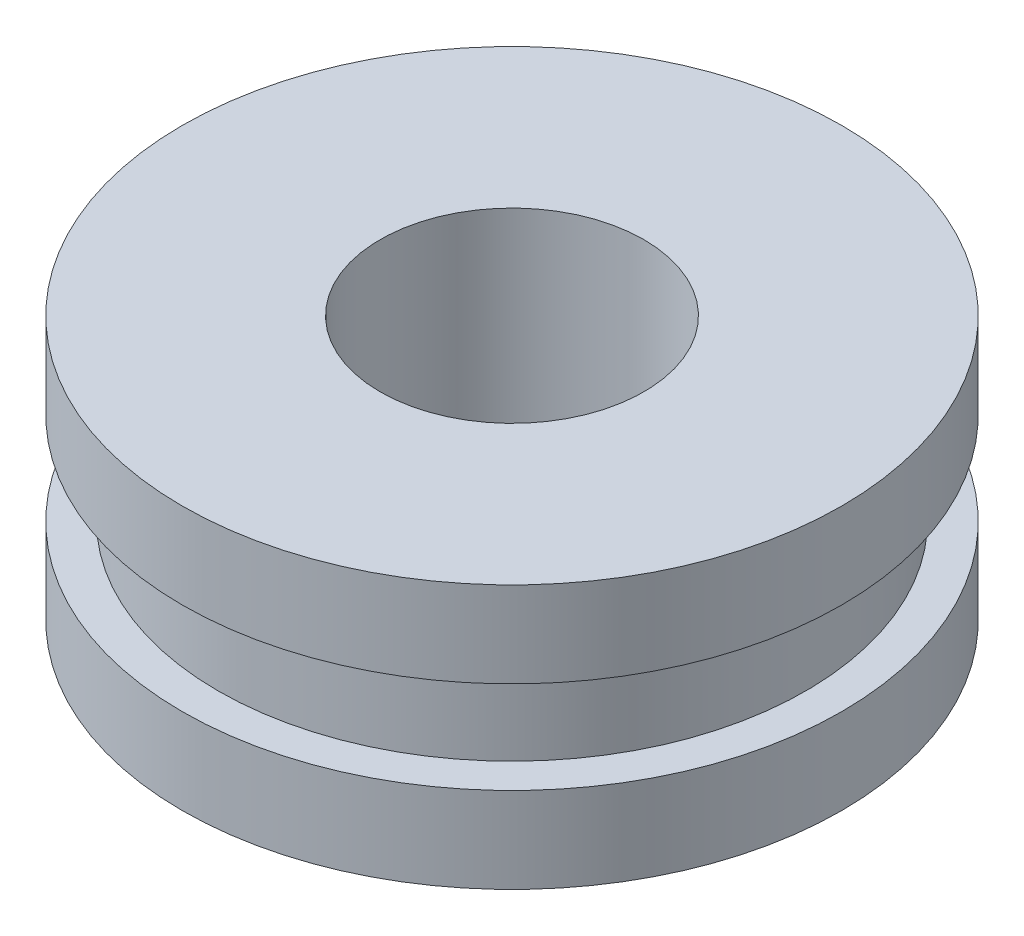
ISO-10303-21;
HEADER;
FILE_DESCRIPTION(('STEP AP214'),'2;1');
FILE_NAME('part.step','',(''),(''),'','','');
FILE_SCHEMA(('AUTOMOTIVE_DESIGN { 1 0 10303 214 1 1 1 1 }'));
ENDSEC;
DATA;
#1=APPLICATION_CONTEXT('core data for automotive mechanical design processes');
#2=APPLICATION_PROTOCOL_DEFINITION('international standard','automotive_design',2000,#1);
#3=PRODUCT_CONTEXT('',#1,'mechanical');
#4=PRODUCT('Part','Part','',(#3));
#5=PRODUCT_RELATED_PRODUCT_CATEGORY('part','',(#4));
#6=PRODUCT_DEFINITION_FORMATION('','',#4);
#7=PRODUCT_DEFINITION_CONTEXT('part definition',#1,'design');
#8=PRODUCT_DEFINITION('design','',#6,#7);
#9=PRODUCT_DEFINITION_SHAPE('','',#8);
#10=(LENGTH_UNIT() NAMED_UNIT(*) SI_UNIT(.MILLI.,.METRE.));
#11=(NAMED_UNIT(*) PLANE_ANGLE_UNIT() SI_UNIT($,.RADIAN.));
#12=(NAMED_UNIT(*) SI_UNIT($,.STERADIAN.) SOLID_ANGLE_UNIT());
#13=UNCERTAINTY_MEASURE_WITH_UNIT(LENGTH_MEASURE(1.E-05),#10,'distance_accuracy_value','');
#14=(GEOMETRIC_REPRESENTATION_CONTEXT(3) GLOBAL_UNCERTAINTY_ASSIGNED_CONTEXT((#13)) GLOBAL_UNIT_ASSIGNED_CONTEXT((#10,
#11,#12)) REPRESENTATION_CONTEXT('',''));
#15=CARTESIAN_POINT('',(0.,0.,0.));
#16=DIRECTION('',(0.,0.,1.));
#17=DIRECTION('',(1.,0.,0.));
#18=AXIS2_PLACEMENT_3D('',#15,#16,#17);
#19=CARTESIAN_POINT('',(0.,1.3,0.));
#20=DIRECTION('',(0.,1.,0.));
#21=DIRECTION('',(0.,0.,1.));
#22=AXIS2_PLACEMENT_3D('',#19,#20,#21);
#23=PLANE('',#22);
#24=CARTESIAN_POINT('',(0.,1.3,0.));
#25=DIRECTION('',(0.,1.,0.));
#26=DIRECTION('',(0.,0.,1.));
#27=AXIS2_PLACEMENT_3D('',#24,#25,#26);
#28=CIRCLE('',#27,4.45630958866855);
#29=CARTESIAN_POINT('',(0.,1.3,4.45630958866855));
#30=VERTEX_POINT('',#29);
#31=EDGE_CURVE('E10',#30,#30,#28,.T.);
#32=ORIENTED_EDGE('',*,*,#31,.F.);
#33=EDGE_LOOP('',(#32));
#34=FACE_BOUND('',#33,.T.);
#35=CARTESIAN_POINT('',(0.,1.3,0.));
#36=DIRECTION('',(0.,1.,0.));
#37=DIRECTION('',(0.,0.,1.));
#38=AXIS2_PLACEMENT_3D('',#35,#36,#37);
#39=CIRCLE('',#38,5.);
#40=CARTESIAN_POINT('',(0.,1.3,5.));
#41=VERTEX_POINT('',#40);
#42=EDGE_CURVE('E42',#41,#41,#39,.T.);
#43=ORIENTED_EDGE('',*,*,#42,.T.);
#44=EDGE_LOOP('',(#43));
#45=FACE_BOUND('',#44,.T.);
#46=ADVANCED_FACE('F34',(#34,#45),#23,.T.);
#47=CARTESIAN_POINT('',(0.,0.,0.));
#48=DIRECTION('',(0.,1.,0.));
#49=DIRECTION('',(0.,0.,1.));
#50=AXIS2_PLACEMENT_3D('',#47,#48,#49);
#51=PLANE('',#50);
#52=CARTESIAN_POINT('',(0.,0.,0.));
#53=DIRECTION('',(0.,1.,0.));
#54=DIRECTION('',(0.,0.,1.));
#55=AXIS2_PLACEMENT_3D('',#52,#53,#54);
#56=CIRCLE('',#55,5.);
#57=CARTESIAN_POINT('',(0.,0.,5.));
#58=VERTEX_POINT('',#57);
#59=EDGE_CURVE('E38',#58,#58,#56,.T.);
#60=ORIENTED_EDGE('',*,*,#59,.F.);
#61=EDGE_LOOP('',(#60));
#62=FACE_BOUND('',#61,.T.);
#63=CARTESIAN_POINT('',(0.,0.,0.));
#64=DIRECTION('',(0.,1.,0.));
#65=DIRECTION('',(0.,0.,1.));
#66=AXIS2_PLACEMENT_3D('',#63,#64,#65);
#67=CIRCLE('',#66,2.);
#68=CARTESIAN_POINT('',(0.,0.,2.));
#69=VERTEX_POINT('',#68);
#70=EDGE_CURVE('E51',#69,#69,#67,.T.);
#71=ORIENTED_EDGE('',*,*,#70,.T.);
#72=EDGE_LOOP('',(#71));
#73=FACE_BOUND('',#72,.T.);
#74=ADVANCED_FACE('F87',(#62,#73),#51,.F.);
#75=CARTESIAN_POINT('',(0.,1.3,0.));
#76=DIRECTION('',(0.,-1.,0.));
#77=DIRECTION('',(0.,0.,-1.));
#78=AXIS2_PLACEMENT_3D('',#75,#76,#77);
#79=CYLINDRICAL_SURFACE('',#78,5.);
#80=ORIENTED_EDGE('',*,*,#42,.F.);
#81=EDGE_LOOP('',(#80));
#82=FACE_BOUND('',#81,.T.);
#83=ORIENTED_EDGE('',*,*,#59,.T.);
#84=EDGE_LOOP('',(#83));
#85=FACE_BOUND('',#84,.T.);
#86=ADVANCED_FACE('F36',(#82,#85),#79,.T.);
#87=CARTESIAN_POINT('',(0.,1.3,0.));
#88=DIRECTION('',(0.,-1.,0.));
#89=DIRECTION('',(0.,0.,-1.));
#90=AXIS2_PLACEMENT_3D('',#87,#88,#89);
#91=CYLINDRICAL_SURFACE('',#90,2.);
#92=ORIENTED_EDGE('',*,*,#70,.F.);
#93=EDGE_LOOP('',(#92));
#94=FACE_BOUND('',#93,.T.);
#95=CARTESIAN_POINT('',(0.,4.,0.));
#96=DIRECTION('',(0.,1.,0.));
#97=DIRECTION('',(0.,0.,1.));
#98=AXIS2_PLACEMENT_3D('',#95,#96,#97);
#99=CIRCLE('',#98,2.);
#100=CARTESIAN_POINT('',(0.,4.,2.));
#101=VERTEX_POINT('',#100);
#102=EDGE_CURVE('E66',#101,#101,#99,.T.);
#103=ORIENTED_EDGE('',*,*,#102,.T.);
#104=EDGE_LOOP('',(#103));
#105=FACE_BOUND('',#104,.T.);
#106=ADVANCED_FACE('F71',(#94,#105),#91,.F.);
#107=CARTESIAN_POINT('',(0.,2.7,0.));
#108=DIRECTION('',(0.,-1.,0.));
#109=DIRECTION('',(0.,0.,-1.));
#110=AXIS2_PLACEMENT_3D('',#107,#108,#109);
#111=CYLINDRICAL_SURFACE('',#110,4.45630958866855);
#112=CARTESIAN_POINT('',(0.,2.7,0.));
#113=DIRECTION('',(0.,1.,0.));
#114=DIRECTION('',(0.,0.,1.));
#115=AXIS2_PLACEMENT_3D('',#112,#113,#114);
#116=CIRCLE('',#115,4.45630958866855);
#117=CARTESIAN_POINT('',(0.,2.7,4.45630958866855));
#118=VERTEX_POINT('',#117);
#119=EDGE_CURVE('E49',#118,#118,#116,.T.);
#120=ORIENTED_EDGE('',*,*,#119,.F.);
#121=EDGE_LOOP('',(#120));
#122=FACE_BOUND('',#121,.T.);
#123=ORIENTED_EDGE('',*,*,#31,.T.);
#124=EDGE_LOOP('',(#123));
#125=FACE_BOUND('',#124,.T.);
#126=ADVANCED_FACE('F76',(#122,#125),#111,.T.);
#127=CARTESIAN_POINT('',(0.,4.,0.));
#128=DIRECTION('',(0.,1.,0.));
#129=DIRECTION('',(0.,0.,1.));
#130=AXIS2_PLACEMENT_3D('',#127,#128,#129);
#131=PLANE('',#130);
#132=CARTESIAN_POINT('',(0.,4.,0.));
#133=DIRECTION('',(0.,1.,0.));
#134=DIRECTION('',(0.,0.,1.));
#135=AXIS2_PLACEMENT_3D('',#132,#133,#134);
#136=CIRCLE('',#135,5.);
#137=CARTESIAN_POINT('',(0.,4.,5.));
#138=VERTEX_POINT('',#137);
#139=EDGE_CURVE('E57',#138,#138,#136,.T.);
#140=ORIENTED_EDGE('',*,*,#139,.T.);
#141=EDGE_LOOP('',(#140));
#142=FACE_BOUND('',#141,.T.);
#143=ORIENTED_EDGE('',*,*,#102,.F.);
#144=EDGE_LOOP('',(#143));
#145=FACE_BOUND('',#144,.T.);
#146=ADVANCED_FACE('F73',(#142,#145),#131,.T.);
#147=CARTESIAN_POINT('',(0.,2.7,0.));
#148=DIRECTION('',(0.,1.,0.));
#149=DIRECTION('',(0.,0.,1.));
#150=AXIS2_PLACEMENT_3D('',#147,#148,#149);
#151=PLANE('',#150);
#152=ORIENTED_EDGE('',*,*,#119,.T.);
#153=EDGE_LOOP('',(#152));
#154=FACE_BOUND('',#153,.T.);
#155=CARTESIAN_POINT('',(0.,2.7,0.));
#156=DIRECTION('',(0.,1.,0.));
#157=DIRECTION('',(0.,0.,1.));
#158=AXIS2_PLACEMENT_3D('',#155,#156,#157);
#159=CIRCLE('',#158,5.);
#160=CARTESIAN_POINT('',(0.,2.7,5.));
#161=VERTEX_POINT('',#160);
#162=EDGE_CURVE('E61',#161,#161,#159,.T.);
#163=ORIENTED_EDGE('',*,*,#162,.F.);
#164=EDGE_LOOP('',(#163));
#165=FACE_BOUND('',#164,.T.);
#166=ADVANCED_FACE('F75',(#154,#165),#151,.F.);
#167=CARTESIAN_POINT('',(0.,4.,0.));
#168=DIRECTION('',(0.,-1.,0.));
#169=DIRECTION('',(0.,0.,-1.));
#170=AXIS2_PLACEMENT_3D('',#167,#168,#169);
#171=CYLINDRICAL_SURFACE('',#170,5.);
#172=ORIENTED_EDGE('',*,*,#139,.F.);
#173=EDGE_LOOP('',(#172));
#174=FACE_BOUND('',#173,.T.);
#175=ORIENTED_EDGE('',*,*,#162,.T.);
#176=EDGE_LOOP('',(#175));
#177=FACE_BOUND('',#176,.T.);
#178=ADVANCED_FACE('F82',(#174,#177),#171,.T.);
#179=CLOSED_SHELL('',(#46,#74,#86,#106,#126,#146,#166,#178));
#180=MANIFOLD_SOLID_BREP('B2',#179);
#181=ADVANCED_BREP_SHAPE_REPRESENTATION('',(#18,#180),#14);
#182=SHAPE_DEFINITION_REPRESENTATION(#9,#181);
ENDSEC;
END-ISO-10303-21;
